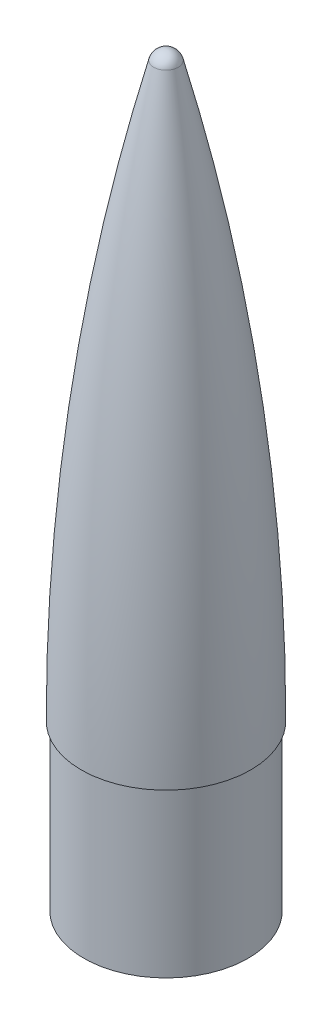
ISO-10303-21;
HEADER;
FILE_DESCRIPTION(('STEP AP214'),'2;1');
FILE_NAME('part.step','',(''),(''),'','','');
FILE_SCHEMA(('AUTOMOTIVE_DESIGN { 1 0 10303 214 1 1 1 1 }'));
ENDSEC;
DATA;
#1=APPLICATION_CONTEXT('core data for automotive mechanical design processes');
#2=APPLICATION_PROTOCOL_DEFINITION('international standard','automotive_design',2000,#1);
#3=PRODUCT_CONTEXT('',#1,'mechanical');
#4=PRODUCT('Part','Part','',(#3));
#5=PRODUCT_RELATED_PRODUCT_CATEGORY('part','',(#4));
#6=PRODUCT_DEFINITION_FORMATION('','',#4);
#7=PRODUCT_DEFINITION_CONTEXT('part definition',#1,'design');
#8=PRODUCT_DEFINITION('design','',#6,#7);
#9=PRODUCT_DEFINITION_SHAPE('','',#8);
#10=(LENGTH_UNIT() NAMED_UNIT(*) SI_UNIT(.MILLI.,.METRE.));
#11=(NAMED_UNIT(*) PLANE_ANGLE_UNIT() SI_UNIT($,.RADIAN.));
#12=(NAMED_UNIT(*) SI_UNIT($,.STERADIAN.) SOLID_ANGLE_UNIT());
#13=UNCERTAINTY_MEASURE_WITH_UNIT(LENGTH_MEASURE(1.E-05),#10,'distance_accuracy_value','');
#14=(GEOMETRIC_REPRESENTATION_CONTEXT(3) GLOBAL_UNCERTAINTY_ASSIGNED_CONTEXT((#13)) GLOBAL_UNIT_ASSIGNED_CONTEXT((#10,
#11,#12)) REPRESENTATION_CONTEXT('',''));
#15=CARTESIAN_POINT('',(0.,0.,0.));
#16=DIRECTION('',(0.,0.,1.));
#17=DIRECTION('',(1.,0.,0.));
#18=AXIS2_PLACEMENT_3D('',#15,#16,#17);
#19=CARTESIAN_POINT('',(0.,290.,0.));
#20=DIRECTION('',(0.,-1.,0.));
#21=DIRECTION('',(1.,0.,0.));
#22=AXIS2_PLACEMENT_3D('',#19,#20,#21);
#23=SPHERICAL_SURFACE('',#22,5.00000000000001);
#24=CARTESIAN_POINT('',(0.,291.246664625345,0.));
#25=DIRECTION('',(0.,-1.,0.));
#26=DIRECTION('',(0.,0.,-1.));
#27=AXIS2_PLACEMENT_3D('',#24,#25,#26);
#28=CIRCLE('',#27,4.84208914745632);
#29=CARTESIAN_POINT('',(0.,291.246664625345,-4.84208914745632));
#30=VERTEX_POINT('',#29);
#31=EDGE_CURVE('E10',#30,#30,#28,.T.);
#32=ORIENTED_EDGE('',*,*,#31,.F.);
#33=EDGE_LOOP('',(#32));
#34=FACE_BOUND('',#33,.T.);
#35=ADVANCED_FACE('F32',(#34),#23,.T.);
#36=CARTESIAN_POINT('',(0.,65.,0.));
#37=DIRECTION('',(0.,-1.,0.));
#38=DIRECTION('',(0.,0.,-1.));
#39=AXIS2_PLACEMENT_3D('',#36,#37,#38);
#40=DEGENERATE_TOROIDAL_SURFACE('',#39,873.90789473684,907.40789473684,.F.);
#41=ORIENTED_EDGE('',*,*,#31,.T.);
#42=EDGE_LOOP('',(#41));
#43=FACE_BOUND('',#42,.T.);
#44=CARTESIAN_POINT('',(0.,65.,0.));
#45=DIRECTION('',(0.,-1.,0.));
#46=DIRECTION('',(0.,0.,-1.));
#47=AXIS2_PLACEMENT_3D('',#44,#45,#46);
#48=CIRCLE('',#47,33.5);
#49=CARTESIAN_POINT('',(0.,65.,-33.5));
#50=VERTEX_POINT('',#49);
#51=EDGE_CURVE('E38',#50,#50,#48,.T.);
#52=ORIENTED_EDGE('',*,*,#51,.F.);
#53=EDGE_LOOP('',(#52));
#54=FACE_BOUND('',#53,.T.);
#55=ADVANCED_FACE('F64',(#43,#54),#40,.F.);
#56=CARTESIAN_POINT('',(33.5,65.,0.));
#57=DIRECTION('',(0.,-1.,0.));
#58=DIRECTION('',(0.,0.,-1.));
#59=AXIS2_PLACEMENT_3D('',#56,#57,#58);
#60=PLANE('',#59);
#61=ORIENTED_EDGE('',*,*,#51,.T.);
#62=EDGE_LOOP('',(#61));
#63=FACE_BOUND('',#62,.T.);
#64=CARTESIAN_POINT('',(0.,65.,0.));
#65=DIRECTION('',(0.,-1.,0.));
#66=DIRECTION('',(0.,0.,-1.));
#67=AXIS2_PLACEMENT_3D('',#64,#65,#66);
#68=CIRCLE('',#67,32.5);
#69=CARTESIAN_POINT('',(0.,65.,-32.5));
#70=VERTEX_POINT('',#69);
#71=EDGE_CURVE('E42',#70,#70,#68,.T.);
#72=ORIENTED_EDGE('',*,*,#71,.F.);
#73=EDGE_LOOP('',(#72));
#74=FACE_BOUND('',#73,.T.);
#75=ADVANCED_FACE('F56',(#63,#74),#60,.T.);
#76=CARTESIAN_POINT('',(0.,0.,0.));
#77=DIRECTION('',(0.,-1.,0.));
#78=DIRECTION('',(0.,0.,-1.));
#79=AXIS2_PLACEMENT_3D('',#76,#77,#78);
#80=CYLINDRICAL_SURFACE('',#79,32.5);
#81=ORIENTED_EDGE('',*,*,#71,.T.);
#82=EDGE_LOOP('',(#81));
#83=FACE_BOUND('',#82,.T.);
#84=CARTESIAN_POINT('',(0.,0.,0.));
#85=DIRECTION('',(0.,-1.,0.));
#86=DIRECTION('',(0.,0.,-1.));
#87=AXIS2_PLACEMENT_3D('',#84,#85,#86);
#88=CIRCLE('',#87,32.5);
#89=CARTESIAN_POINT('',(0.,0.,-32.5));
#90=VERTEX_POINT('',#89);
#91=EDGE_CURVE('E46',#90,#90,#88,.T.);
#92=ORIENTED_EDGE('',*,*,#91,.F.);
#93=EDGE_LOOP('',(#92));
#94=FACE_BOUND('',#93,.T.);
#95=ADVANCED_FACE('F54',(#83,#94),#80,.T.);
#96=CARTESIAN_POINT('',(0.,0.,0.));
#97=DIRECTION('',(0.,-1.,0.));
#98=DIRECTION('',(0.,0.,-1.));
#99=AXIS2_PLACEMENT_3D('',#96,#97,#98);
#100=PLANE('',#99);
#101=ORIENTED_EDGE('',*,*,#91,.T.);
#102=EDGE_LOOP('',(#101));
#103=FACE_BOUND('',#102,.T.);
#104=ADVANCED_FACE('F52',(#103),#100,.T.);
#105=CLOSED_SHELL('',(#35,#55,#75,#95,#104));
#106=MANIFOLD_SOLID_BREP('B2',#105);
#107=ADVANCED_BREP_SHAPE_REPRESENTATION('',(#18,#106),#14);
#108=SHAPE_DEFINITION_REPRESENTATION(#9,#107);
ENDSEC;
END-ISO-10303-21;
